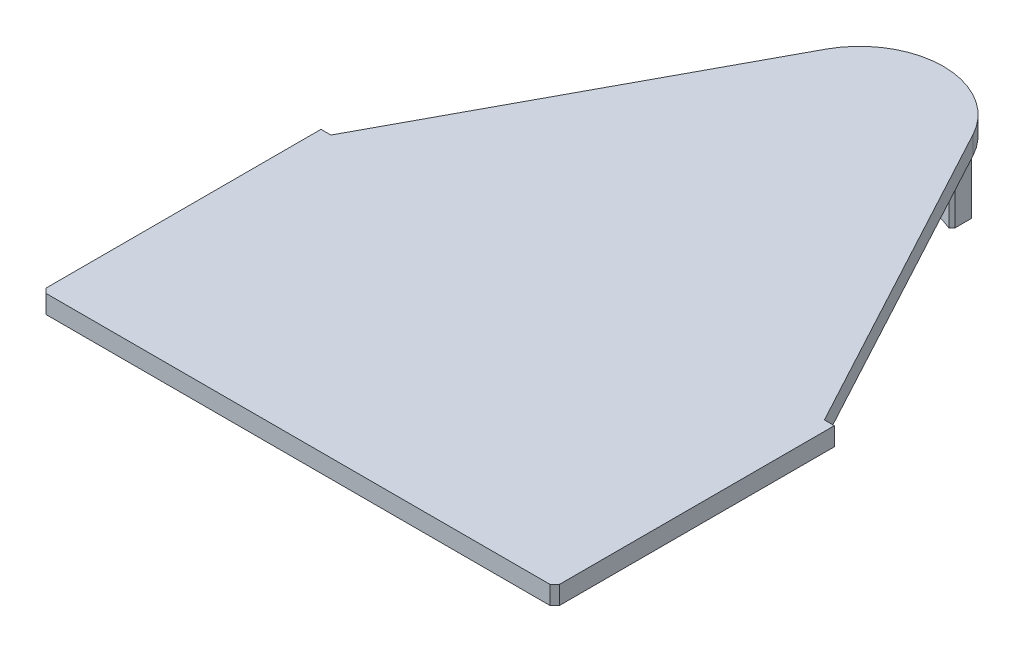
ISO-10303-21;
HEADER;
FILE_DESCRIPTION(('STEP AP214'),'2;1');
FILE_NAME('part.step','',(''),(''),'','','');
FILE_SCHEMA(('AUTOMOTIVE_DESIGN { 1 0 10303 214 1 1 1 1 }'));
ENDSEC;
DATA;
#1=APPLICATION_CONTEXT('core data for automotive mechanical design processes');
#2=APPLICATION_PROTOCOL_DEFINITION('international standard','automotive_design',2000,#1);
#3=PRODUCT_CONTEXT('',#1,'mechanical');
#4=PRODUCT('Part','Part','',(#3));
#5=PRODUCT_RELATED_PRODUCT_CATEGORY('part','',(#4));
#6=PRODUCT_DEFINITION_FORMATION('','',#4);
#7=PRODUCT_DEFINITION_CONTEXT('part definition',#1,'design');
#8=PRODUCT_DEFINITION('design','',#6,#7);
#9=PRODUCT_DEFINITION_SHAPE('','',#8);
#10=(LENGTH_UNIT() NAMED_UNIT(*) SI_UNIT(.MILLI.,.METRE.));
#11=(NAMED_UNIT(*) PLANE_ANGLE_UNIT() SI_UNIT($,.RADIAN.));
#12=(NAMED_UNIT(*) SI_UNIT($,.STERADIAN.) SOLID_ANGLE_UNIT());
#13=UNCERTAINTY_MEASURE_WITH_UNIT(LENGTH_MEASURE(1.E-05),#10,'distance_accuracy_value','');
#14=(GEOMETRIC_REPRESENTATION_CONTEXT(3) GLOBAL_UNCERTAINTY_ASSIGNED_CONTEXT((#13)) GLOBAL_UNIT_ASSIGNED_CONTEXT((#10,
#11,#12)) REPRESENTATION_CONTEXT('',''));
#15=CARTESIAN_POINT('',(0.,0.,0.));
#16=DIRECTION('',(0.,0.,1.));
#17=DIRECTION('',(1.,0.,0.));
#18=AXIS2_PLACEMENT_3D('',#15,#16,#17);
#19=CARTESIAN_POINT('',(0.,0.,0.));
#20=DIRECTION('',(0.,1.,0.));
#21=DIRECTION('',(0.,0.,1.));
#22=AXIS2_PLACEMENT_3D('',#19,#20,#21);
#23=PLANE('',#22);
#24=CARTESIAN_POINT('',(-4.,0.,-31.8382479884705));
#25=CARTESIAN_POINT('',(0.,0.,-33.6817520115295));
#26=CARTESIAN_POINT('',(4.,0.,-31.8382479884705));
#27=B_SPLINE_CURVE_WITH_KNOTS('',2,(#24,#25,#26),.UNSPECIFIED.,.F.,.F.,(3,3),(0.,1.),.UNSPECIFIED.);
#28=CARTESIAN_POINT('',(-4.,0.,-31.8382479884705));
#29=VERTEX_POINT('',#28);
#30=CARTESIAN_POINT('',(3.18321757841744E-13,0.,-32.76));
#31=VERTEX_POINT('',#30);
#32=EDGE_CURVE('E426',#29,#31,#27,.T.);
#33=ORIENTED_EDGE('',*,*,#32,.F.);
#34=CARTESIAN_POINT('',(0.,0.,-23.62));
#35=DIRECTION('',(0.,1.,0.));
#36=DIRECTION('',(0.,0.,1.));
#37=AXIS2_PLACEMENT_3D('',#34,#35,#36);
#38=CIRCLE('',#37,9.13999999999999);
#39=EDGE_CURVE('E429',#31,#29,#38,.T.);
#40=ORIENTED_EDGE('',*,*,#39,.F.);
#41=EDGE_LOOP('',(#33,#40));
#42=FACE_BOUND('',#41,.T.);
#43=ADVANCED_FACE('F90',(#42),#23,.F.);
#44=CARTESIAN_POINT('',(-4.,0.,-31.8382479884705));
#45=CARTESIAN_POINT('',(0.,0.,-33.6817520115295));
#46=CARTESIAN_POINT('',(4.,0.,-31.8382479884705));
#47=B_SPLINE_CURVE_WITH_KNOTS('',2,(#44,#45,#46),.UNSPECIFIED.,.F.,.F.,(3,3),(0.,1.),.UNSPECIFIED.);
#48=CARTESIAN_POINT('',(4.,0.,-31.8382479884705));
#49=VERTEX_POINT('',#48);
#50=EDGE_CURVE('E259',#31,#49,#47,.T.);
#51=ORIENTED_EDGE('',*,*,#50,.F.);
#52=EDGE_CURVE('E448',#49,#31,#38,.T.);
#53=ORIENTED_EDGE('',*,*,#52,.F.);
#54=EDGE_LOOP('',(#51,#53));
#55=FACE_BOUND('',#54,.T.);
#56=ADVANCED_FACE('F378',(#55),#23,.F.);
#57=CARTESIAN_POINT('',(17.9019676985238,2.,-9.62552877947724));
#58=DIRECTION('',(0.880758300386652,0.,-0.473566063290029));
#59=DIRECTION('',(-0.473566063290029,0.,-0.880758300386652));
#60=AXIS2_PLACEMENT_3D('',#57,#58,#59);
#61=PLANE('',#60);
#62=DIRECTION('',(0.473566063290029,0.,0.880758300386652));
#63=VECTOR('',#62,1.);
#64=CARTESIAN_POINT('',(17.9019676985238,0.,-9.62552877947724));
#65=LINE('',#64,#63);
#66=CARTESIAN_POINT('',(8.05013086553399,0.,-27.9483938184709));
#67=VERTEX_POINT('',#66);
#68=CARTESIAN_POINT('',(26.9164560769895,0.,7.13999999999998));
#69=VERTEX_POINT('',#68);
#70=EDGE_CURVE('E443',#67,#69,#65,.T.);
#71=ORIENTED_EDGE('',*,*,#70,.F.);
#72=DIRECTION('',(0.,-1.,0.));
#73=VECTOR('',#72,1.);
#74=CARTESIAN_POINT('',(8.05013086553399,2.,-27.9483938184709));
#75=LINE('',#74,#73);
#76=CARTESIAN_POINT('',(8.05013086553399,2.,-27.9483938184709));
#77=VERTEX_POINT('',#76);
#78=EDGE_CURVE('E508',#77,#67,#75,.T.);
#79=ORIENTED_EDGE('',*,*,#78,.F.);
#80=DIRECTION('',(0.473566063290029,0.,0.880758300386652));
#81=VECTOR('',#80,1.);
#82=CARTESIAN_POINT('',(17.9019676985238,2.,-9.62552877947724));
#83=LINE('',#82,#81);
#84=CARTESIAN_POINT('',(26.9164560769895,2.,7.13999999999998));
#85=VERTEX_POINT('',#84);
#86=EDGE_CURVE('E486',#77,#85,#83,.T.);
#87=ORIENTED_EDGE('',*,*,#86,.T.);
#88=DIRECTION('',(0.,-1.,0.));
#89=VECTOR('',#88,1.);
#90=CARTESIAN_POINT('',(26.9164560769895,2.,7.13999999999998));
#91=LINE('',#90,#89);
#92=EDGE_CURVE('E255',#85,#69,#91,.T.);
#93=ORIENTED_EDGE('',*,*,#92,.T.);
#94=EDGE_LOOP('',(#71,#79,#87,#93));
#95=FACE_BOUND('',#94,.T.);
#96=ADVANCED_FACE('F385',(#95),#61,.T.);
#97=CARTESIAN_POINT('',(0.,2.,-23.62));
#98=DIRECTION('',(0.,-1.,0.));
#99=DIRECTION('',(0.,0.,-1.));
#100=AXIS2_PLACEMENT_3D('',#97,#98,#99);
#101=CYLINDRICAL_SURFACE('',#100,9.13999999999999);
#102=EDGE_CURVE('E445',#67,#49,#38,.T.);
#103=ORIENTED_EDGE('',*,*,#102,.T.);
#104=ORIENTED_EDGE('',*,*,#52,.T.);
#105=ORIENTED_EDGE('',*,*,#39,.T.);
#106=CARTESIAN_POINT('',(-8.05013086553398,0.,-27.9483938184709));
#107=VERTEX_POINT('',#106);
#108=EDGE_CURVE('E437',#29,#107,#38,.T.);
#109=ORIENTED_EDGE('',*,*,#108,.T.);
#110=DIRECTION('',(0.,-1.,0.));
#111=VECTOR('',#110,1.);
#112=CARTESIAN_POINT('',(-8.05013086553398,2.,-27.9483938184709));
#113=LINE('',#112,#111);
#114=CARTESIAN_POINT('',(-8.05013086553398,2.,-27.9483938184709));
#115=VERTEX_POINT('',#114);
#116=EDGE_CURVE('E505',#115,#107,#113,.T.);
#117=ORIENTED_EDGE('',*,*,#116,.F.);
#118=CARTESIAN_POINT('',(0.,2.,-23.62));
#119=DIRECTION('',(0.,1.,0.));
#120=DIRECTION('',(0.,0.,1.));
#121=AXIS2_PLACEMENT_3D('',#118,#119,#120);
#122=CIRCLE('',#121,9.13999999999999);
#123=EDGE_CURVE('E490',#77,#115,#122,.T.);
#124=ORIENTED_EDGE('',*,*,#123,.F.);
#125=ORIENTED_EDGE('',*,*,#78,.T.);
#126=EDGE_LOOP('',(#103,#104,#105,#109,#117,#124,#125));
#127=FACE_BOUND('',#126,.T.);
#128=ADVANCED_FACE('F381',(#127),#101,.T.);
#129=CARTESIAN_POINT('',(-17.9019676985238,2.,-9.62552877947723));
#130=DIRECTION('',(-0.880758300386652,0.,-0.473566063290029));
#131=DIRECTION('',(-0.473566063290029,0.,0.880758300386652));
#132=AXIS2_PLACEMENT_3D('',#129,#130,#131);
#133=PLANE('',#132);
#134=DIRECTION('',(0.473566063290029,0.,-0.880758300386652));
#135=VECTOR('',#134,1.);
#136=CARTESIAN_POINT('',(-17.9019676985238,0.,-9.62552877947723));
#137=LINE('',#136,#135);
#138=CARTESIAN_POINT('',(-26.9164560769895,0.,7.14));
#139=VERTEX_POINT('',#138);
#140=EDGE_CURVE('E439',#139,#107,#137,.T.);
#141=ORIENTED_EDGE('',*,*,#140,.F.);
#142=DIRECTION('',(0.,-1.,0.));
#143=VECTOR('',#142,1.);
#144=CARTESIAN_POINT('',(-26.9164560769895,2.,7.14));
#145=LINE('',#144,#143);
#146=CARTESIAN_POINT('',(-26.9164560769895,2.,7.14));
#147=VERTEX_POINT('',#146);
#148=EDGE_CURVE('E235',#147,#139,#145,.T.);
#149=ORIENTED_EDGE('',*,*,#148,.F.);
#150=DIRECTION('',(0.473566063290029,0.,-0.880758300386652));
#151=VECTOR('',#150,1.);
#152=CARTESIAN_POINT('',(-17.9019676985238,2.,-9.62552877947723));
#153=LINE('',#152,#151);
#154=EDGE_CURVE('E493',#147,#115,#153,.T.);
#155=ORIENTED_EDGE('',*,*,#154,.T.);
#156=ORIENTED_EDGE('',*,*,#116,.T.);
#157=EDGE_LOOP('',(#141,#149,#155,#156));
#158=FACE_BOUND('',#157,.T.);
#159=ADVANCED_FACE('F376',(#158),#133,.T.);
#160=CARTESIAN_POINT('',(0.,0.,-11.81));
#161=DIRECTION('',(0.,1.,0.));
#162=DIRECTION('',(0.,0.,1.));
#163=AXIS2_PLACEMENT_3D('',#160,#161,#162);
#164=CIRCLE('',#163,3.5);
#165=CARTESIAN_POINT('',(0.,0.,-8.31));
#166=VERTEX_POINT('',#165);
#167=EDGE_CURVE('E247',#166,#166,#164,.T.);
#168=ORIENTED_EDGE('',*,*,#167,.T.);
#169=EDGE_LOOP('',(#168));
#170=FACE_BOUND('',#169,.T.);
#171=DIRECTION('',(0.,0.,-1.));
#172=VECTOR('',#171,1.);
#173=CARTESIAN_POINT('',(28.,0.,39.14));
#174=LINE('',#173,#172);
#175=CARTESIAN_POINT('',(28.,0.,37.14));
#176=VERTEX_POINT('',#175);
#177=CARTESIAN_POINT('',(28.,0.,7.13999999999999));
#178=VERTEX_POINT('',#177);
#179=EDGE_CURVE('E230',#176,#178,#174,.T.);
#180=ORIENTED_EDGE('',*,*,#179,.F.);
#181=DIRECTION('',(0.707106781186548,0.,-0.707106781186548));
#182=VECTOR('',#181,1.);
#183=CARTESIAN_POINT('',(28.,0.,37.14));
#184=LINE('',#183,#182);
#185=CARTESIAN_POINT('',(27.5,0.,37.64));
#186=VERTEX_POINT('',#185);
#187=EDGE_CURVE('E301',#176,#186,#184,.F.);
#188=ORIENTED_EDGE('',*,*,#187,.T.);
#189=DIRECTION('',(1.,0.,0.));
#190=VECTOR('',#189,1.);
#191=CARTESIAN_POINT('',(-28.,0.,37.64));
#192=LINE('',#191,#190);
#193=CARTESIAN_POINT('',(-27.5,0.,37.64));
#194=VERTEX_POINT('',#193);
#195=EDGE_CURVE('E328',#194,#186,#192,.T.);
#196=ORIENTED_EDGE('',*,*,#195,.F.);
#197=DIRECTION('',(0.707106781186548,0.,0.707106781186548));
#198=VECTOR('',#197,1.);
#199=CARTESIAN_POINT('',(-28.,0.,37.14));
#200=LINE('',#199,#198);
#201=CARTESIAN_POINT('',(-28.,0.,37.14));
#202=VERTEX_POINT('',#201);
#203=EDGE_CURVE('E228',#194,#202,#200,.F.);
#204=ORIENTED_EDGE('',*,*,#203,.T.);
#205=DIRECTION('',(0.,0.,1.));
#206=VECTOR('',#205,1.);
#207=CARTESIAN_POINT('',(-28.,0.,39.14));
#208=LINE('',#207,#206);
#209=CARTESIAN_POINT('',(-28.,0.,7.13999999999998));
#210=VERTEX_POINT('',#209);
#211=EDGE_CURVE('E211',#210,#202,#208,.T.);
#212=ORIENTED_EDGE('',*,*,#211,.F.);
#213=DIRECTION('',(1.,0.,0.));
#214=VECTOR('',#213,1.);
#215=CARTESIAN_POINT('',(-29.5,0.,7.14));
#216=LINE('',#215,#214);
#217=EDGE_CURVE('E224',#210,#139,#216,.T.);
#218=ORIENTED_EDGE('',*,*,#217,.T.);
#219=ORIENTED_EDGE('',*,*,#140,.T.);
#220=ORIENTED_EDGE('',*,*,#108,.F.);
#221=DIRECTION('',(0.,0.,1.));
#222=VECTOR('',#221,1.);
#223=CARTESIAN_POINT('',(-4.,0.,0.));
#224=LINE('',#223,#222);
#225=CARTESIAN_POINT('',(-4.,0.,-29.9151086540746));
#226=VERTEX_POINT('',#225);
#227=EDGE_CURVE('E434',#29,#226,#224,.T.);
#228=ORIENTED_EDGE('',*,*,#227,.T.);
#229=DIRECTION('',(-0.938154131916574,0.,-0.346217886262192));
#230=VECTOR('',#229,1.);
#231=CARTESIAN_POINT('',(9.23713172065873,0.,-25.0300566049639));
#232=LINE('',#231,#230);
#233=CARTESIAN_POINT('',(-3.53061183633768,0.,-29.7418849029483));
#234=VERTEX_POINT('',#233);
#235=EDGE_CURVE('E288',#226,#234,#232,.F.);
#236=ORIENTED_EDGE('',*,*,#235,.T.);
#237=CARTESIAN_POINT('',(-4.,0.,-29.5382479884705));
#238=CARTESIAN_POINT('',(0.,0.,-31.3817520115294));
#239=CARTESIAN_POINT('',(4.,0.,-29.5382479884705));
#240=B_SPLINE_CURVE_WITH_KNOTS('',2,(#237,#238,#239),.UNSPECIFIED.,.F.,.F.,(3,3),(0.,1.),.UNSPECIFIED.);
#241=CARTESIAN_POINT('',(3.65299104200132,0.,-29.691239030471));
#242=VERTEX_POINT('',#241);
#243=EDGE_CURVE('E340',#234,#242,#240,.T.);
#244=ORIENTED_EDGE('',*,*,#243,.T.);
#245=DIRECTION('',(-0.707106781186738,0.,0.707106781186358));
#246=VECTOR('',#245,1.);
#247=CARTESIAN_POINT('',(-13.0191239942364,0.,-13.0191239942433));
#248=LINE('',#247,#246);
#249=CARTESIAN_POINT('',(4.,0.,-30.0382479884706));
#250=VERTEX_POINT('',#249);
#251=EDGE_CURVE('E291',#242,#250,#248,.F.);
#252=ORIENTED_EDGE('',*,*,#251,.T.);
#253=DIRECTION('',(0.,0.,1.));
#254=VECTOR('',#253,1.);
#255=CARTESIAN_POINT('',(4.,0.,0.));
#256=LINE('',#255,#254);
#257=EDGE_CURVE('E349',#49,#250,#256,.T.);
#258=ORIENTED_EDGE('',*,*,#257,.F.);
#259=ORIENTED_EDGE('',*,*,#102,.F.);
#260=ORIENTED_EDGE('',*,*,#70,.T.);
#261=EDGE_CURVE('E239',#69,#178,#216,.T.);
#262=ORIENTED_EDGE('',*,*,#261,.T.);
#263=EDGE_LOOP('',(#180,#188,#196,#204,#212,#218,#219,#220,#228,#236,#244,#252,#258,#259,#260,#262));
#264=FACE_BOUND('',#263,.T.);
#265=ADVANCED_FACE('F222',(#170,#264),#23,.F.);
#266=CARTESIAN_POINT('',(0.,2.,0.));
#267=DIRECTION('',(0.,1.,0.));
#268=DIRECTION('',(0.,0.,1.));
#269=AXIS2_PLACEMENT_3D('',#266,#267,#268);
#270=PLANE('',#269);
#271=DIRECTION('',(-1.,0.,0.));
#272=VECTOR('',#271,1.);
#273=CARTESIAN_POINT('',(0.,2.,37.64));
#274=LINE('',#273,#272);
#275=CARTESIAN_POINT('',(27.5,2.,37.64));
#276=VERTEX_POINT('',#275);
#277=CARTESIAN_POINT('',(-27.5,2.,37.64));
#278=VERTEX_POINT('',#277);
#279=EDGE_CURVE('E231',#276,#278,#274,.T.);
#280=ORIENTED_EDGE('',*,*,#279,.F.);
#281=DIRECTION('',(-0.707106781186548,0.,0.707106781186548));
#282=VECTOR('',#281,1.);
#283=CARTESIAN_POINT('',(32.57,2.,32.57));
#284=LINE('',#283,#282);
#285=CARTESIAN_POINT('',(28.,2.,37.14));
#286=VERTEX_POINT('',#285);
#287=EDGE_CURVE('E100',#276,#286,#284,.F.);
#288=ORIENTED_EDGE('',*,*,#287,.T.);
#289=DIRECTION('',(0.,0.,1.));
#290=VECTOR('',#289,1.);
#291=CARTESIAN_POINT('',(28.,2.,0.));
#292=LINE('',#291,#290);
#293=CARTESIAN_POINT('',(28.,2.,7.13999999999998));
#294=VERTEX_POINT('',#293);
#295=EDGE_CURVE('E317',#294,#286,#292,.T.);
#296=ORIENTED_EDGE('',*,*,#295,.F.);
#297=DIRECTION('',(1.,0.,0.));
#298=VECTOR('',#297,1.);
#299=CARTESIAN_POINT('',(-29.5,2.,7.14));
#300=LINE('',#299,#298);
#301=EDGE_CURVE('E238',#85,#294,#300,.T.);
#302=ORIENTED_EDGE('',*,*,#301,.F.);
#303=ORIENTED_EDGE('',*,*,#86,.F.);
#304=ORIENTED_EDGE('',*,*,#123,.T.);
#305=ORIENTED_EDGE('',*,*,#154,.F.);
#306=CARTESIAN_POINT('',(-28.,2.,7.14));
#307=VERTEX_POINT('',#306);
#308=EDGE_CURVE('E244',#307,#147,#300,.T.);
#309=ORIENTED_EDGE('',*,*,#308,.F.);
#310=DIRECTION('',(0.,0.,-1.));
#311=VECTOR('',#310,1.);
#312=CARTESIAN_POINT('',(-28.,2.,0.));
#313=LINE('',#312,#311);
#314=CARTESIAN_POINT('',(-28.,2.,37.14));
#315=VERTEX_POINT('',#314);
#316=EDGE_CURVE('E212',#315,#307,#313,.T.);
#317=ORIENTED_EDGE('',*,*,#316,.F.);
#318=DIRECTION('',(-0.707106781186548,0.,-0.707106781186548));
#319=VECTOR('',#318,1.);
#320=CARTESIAN_POINT('',(-32.57,2.,32.57));
#321=LINE('',#320,#319);
#322=EDGE_CURVE('E107',#315,#278,#321,.F.);
#323=ORIENTED_EDGE('',*,*,#322,.T.);
#324=EDGE_LOOP('',(#280,#288,#296,#302,#303,#304,#305,#309,#317,#323));
#325=FACE_BOUND('',#324,.T.);
#326=ADVANCED_FACE('F315',(#325),#270,.T.);
#327=CARTESIAN_POINT('',(-29.5,2.,7.14));
#328=DIRECTION('',(0.,0.,-1.));
#329=DIRECTION('',(-1.,0.,0.));
#330=AXIS2_PLACEMENT_3D('',#327,#328,#329);
#331=PLANE('',#330);
#332=DIRECTION('',(0.,-1.,0.));
#333=VECTOR('',#332,1.);
#334=CARTESIAN_POINT('',(-28.,2.,7.14));
#335=LINE('',#334,#333);
#336=EDGE_CURVE('E208',#307,#210,#335,.T.);
#337=ORIENTED_EDGE('',*,*,#336,.F.);
#338=ORIENTED_EDGE('',*,*,#308,.T.);
#339=ORIENTED_EDGE('',*,*,#148,.T.);
#340=ORIENTED_EDGE('',*,*,#217,.F.);
#341=EDGE_LOOP('',(#337,#338,#339,#340));
#342=FACE_BOUND('',#341,.T.);
#343=ADVANCED_FACE('F233',(#342),#331,.T.);
#344=DIRECTION('',(0.,1.,0.));
#345=VECTOR('',#344,1.);
#346=CARTESIAN_POINT('',(28.,2.,7.13999999999999));
#347=LINE('',#346,#345);
#348=EDGE_CURVE('E218',#178,#294,#347,.T.);
#349=ORIENTED_EDGE('',*,*,#348,.F.);
#350=ORIENTED_EDGE('',*,*,#261,.F.);
#351=ORIENTED_EDGE('',*,*,#92,.F.);
#352=ORIENTED_EDGE('',*,*,#301,.T.);
#353=EDGE_LOOP('',(#349,#350,#351,#352));
#354=FACE_BOUND('',#353,.T.);
#355=ADVANCED_FACE('F370',(#354),#331,.T.);
#356=CARTESIAN_POINT('',(0.,-9.,-11.81));
#357=DIRECTION('',(0.,1.,0.));
#358=DIRECTION('',(0.,0.,1.));
#359=AXIS2_PLACEMENT_3D('',#356,#357,#358);
#360=CYLINDRICAL_SURFACE('',#359,3.5);
#361=CARTESIAN_POINT('',(0.,-8.5,-11.81));
#362=DIRECTION('',(0.,1.,0.));
#363=DIRECTION('',(0.,0.,1.));
#364=AXIS2_PLACEMENT_3D('',#361,#362,#363);
#365=CIRCLE('',#364,3.5);
#366=CARTESIAN_POINT('',(0.,-8.5,-8.31));
#367=VERTEX_POINT('',#366);
#368=EDGE_CURVE('E250',#367,#367,#365,.T.);
#369=ORIENTED_EDGE('',*,*,#368,.T.);
#370=EDGE_LOOP('',(#369));
#371=FACE_BOUND('',#370,.T.);
#372=ORIENTED_EDGE('',*,*,#167,.F.);
#373=EDGE_LOOP('',(#372));
#374=FACE_BOUND('',#373,.T.);
#375=ADVANCED_FACE('F366',(#371,#374),#360,.T.);
#376=CARTESIAN_POINT('',(0.,-9.,-11.81));
#377=DIRECTION('',(0.,1.,0.));
#378=DIRECTION('',(0.,0.,1.));
#379=AXIS2_PLACEMENT_3D('',#376,#377,#378);
#380=PLANE('',#379);
#381=CARTESIAN_POINT('',(0.,-9.,-11.81));
#382=DIRECTION('',(0.,1.,0.));
#383=DIRECTION('',(0.,0.,1.));
#384=AXIS2_PLACEMENT_3D('',#381,#382,#383);
#385=CIRCLE('',#384,3.);
#386=CARTESIAN_POINT('',(0.,-9.,-8.81));
#387=VERTEX_POINT('',#386);
#388=EDGE_CURVE('E254',#387,#387,#385,.F.);
#389=ORIENTED_EDGE('',*,*,#388,.T.);
#390=EDGE_LOOP('',(#389));
#391=FACE_BOUND('',#390,.T.);
#392=ADVANCED_FACE('F363',(#391),#380,.F.);
#393=CARTESIAN_POINT('',(0.,-8.5,-11.81));
#394=DIRECTION('',(0.,1.,0.));
#395=DIRECTION('',(0.,0.,1.));
#396=AXIS2_PLACEMENT_3D('',#393,#394,#395);
#397=TOROIDAL_SURFACE('',#396,3.,0.5);
#398=ORIENTED_EDGE('',*,*,#388,.F.);
#399=EDGE_LOOP('',(#398));
#400=FACE_BOUND('',#399,.T.);
#401=ORIENTED_EDGE('',*,*,#368,.F.);
#402=EDGE_LOOP('',(#401));
#403=FACE_BOUND('',#402,.T.);
#404=ADVANCED_FACE('F360',(#400,#403),#397,.T.);
#405=CARTESIAN_POINT('',(-4.,-9.9,-29.5382479884705));
#406=CARTESIAN_POINT('',(0.,-9.9,-31.3817520115294));
#407=CARTESIAN_POINT('',(4.,-9.9,-29.5382479884705));
#408=B_SPLINE_CURVE_WITH_KNOTS('',2,(#405,#406,#407),.UNSPECIFIED.,.F.,.F.,(3,3),(0.,1.),.UNSPECIFIED.);
#409=DIRECTION('',(0.,1.,0.));
#410=VECTOR('',#409,1.);
#411=SURFACE_OF_LINEAR_EXTRUSION('',#408,#410);
#412=ORIENTED_EDGE('',*,*,#243,.F.);
#413=DIRECTION('',(0.,1.,0.));
#414=VECTOR('',#413,1.);
#415=CARTESIAN_POINT('',(-3.53061183633005,0.,-29.7418849029514));
#416=LINE('',#415,#414);
#417=CARTESIAN_POINT('',(-3.53061183633767,-9.9,-29.7418849029483));
#418=VERTEX_POINT('',#417);
#419=EDGE_CURVE('E276',#234,#418,#416,.F.);
#420=ORIENTED_EDGE('',*,*,#419,.T.);
#421=CARTESIAN_POINT('',(3.65299104200055,-9.9,-29.6912390304713));
#422=VERTEX_POINT('',#421);
#423=EDGE_CURVE('E341',#418,#422,#408,.T.);
#424=ORIENTED_EDGE('',*,*,#423,.T.);
#425=DIRECTION('',(0.,1.,0.));
#426=VECTOR('',#425,1.);
#427=CARTESIAN_POINT('',(3.65299104200055,-9.9,-29.6912390304713));
#428=LINE('',#427,#426);
#429=EDGE_CURVE('E272',#422,#242,#428,.T.);
#430=ORIENTED_EDGE('',*,*,#429,.T.);
#431=EDGE_LOOP('',(#412,#420,#424,#430));
#432=FACE_BOUND('',#431,.T.);
#433=ADVANCED_FACE('F355',(#432),#411,.T.);
#434=CARTESIAN_POINT('',(-4.,-9.9,0.));
#435=DIRECTION('',(-1.,0.,0.));
#436=DIRECTION('',(0.,0.,1.));
#437=AXIS2_PLACEMENT_3D('',#434,#435,#436);
#438=PLANE('',#437);
#439=DIRECTION('',(0.,0.,1.));
#440=VECTOR('',#439,1.);
#441=CARTESIAN_POINT('',(-4.,-9.9,0.));
#442=LINE('',#441,#440);
#443=CARTESIAN_POINT('',(-3.99999999999999,-9.9,-31.8382479884705));
#444=VERTEX_POINT('',#443);
#445=CARTESIAN_POINT('',(-4.,-9.9,-29.9151086540746));
#446=VERTEX_POINT('',#445);
#447=EDGE_CURVE('E348',#444,#446,#442,.T.);
#448=ORIENTED_EDGE('',*,*,#447,.T.);
#449=DIRECTION('',(0.,1.,0.));
#450=VECTOR('',#449,1.);
#451=CARTESIAN_POINT('',(-4.,-9.9,-29.9151086540746));
#452=LINE('',#451,#450);
#453=EDGE_CURVE('E265',#446,#226,#452,.T.);
#454=ORIENTED_EDGE('',*,*,#453,.T.);
#455=ORIENTED_EDGE('',*,*,#227,.F.);
#456=DIRECTION('',(0.,1.,0.));
#457=VECTOR('',#456,1.);
#458=CARTESIAN_POINT('',(-3.99999999999999,-9.9,-31.8382479884705));
#459=LINE('',#458,#457);
#460=EDGE_CURVE('E451',#444,#29,#459,.T.);
#461=ORIENTED_EDGE('',*,*,#460,.F.);
#462=EDGE_LOOP('',(#448,#454,#455,#461));
#463=FACE_BOUND('',#462,.T.);
#464=ADVANCED_FACE('F359',(#463),#438,.T.);
#465=CARTESIAN_POINT('',(-4.,-9.9,-31.8382479884705));
#466=CARTESIAN_POINT('',(0.,-9.9,-33.6817520115295));
#467=CARTESIAN_POINT('',(4.,-9.9,-31.8382479884705));
#468=B_SPLINE_CURVE_WITH_KNOTS('',2,(#465,#466,#467),.UNSPECIFIED.,.F.,.F.,(3,3),(0.,1.),.UNSPECIFIED.);
#469=DIRECTION('',(0.,1.,0.));
#470=VECTOR('',#469,1.);
#471=SURFACE_OF_LINEAR_EXTRUSION('',#468,#470);
#472=ORIENTED_EDGE('',*,*,#32,.T.);
#473=ORIENTED_EDGE('',*,*,#50,.T.);
#474=DIRECTION('',(0.,1.,0.));
#475=VECTOR('',#474,1.);
#476=CARTESIAN_POINT('',(3.99999999999999,-9.9,-31.8382479884705));
#477=LINE('',#476,#475);
#478=CARTESIAN_POINT('',(3.99999999999999,-9.9,-31.8382479884705));
#479=VERTEX_POINT('',#478);
#480=EDGE_CURVE('E459',#479,#49,#477,.T.);
#481=ORIENTED_EDGE('',*,*,#480,.F.);
#482=EDGE_CURVE('E454',#444,#479,#468,.T.);
#483=ORIENTED_EDGE('',*,*,#482,.F.);
#484=ORIENTED_EDGE('',*,*,#460,.T.);
#485=EDGE_LOOP('',(#472,#473,#481,#483,#484));
#486=FACE_BOUND('',#485,.T.);
#487=ADVANCED_FACE('F452',(#486),#471,.F.);
#488=CARTESIAN_POINT('',(4.,-9.9,0.));
#489=DIRECTION('',(-1.,0.,0.));
#490=DIRECTION('',(0.,0.,1.));
#491=AXIS2_PLACEMENT_3D('',#488,#489,#490);
#492=PLANE('',#491);
#493=ORIENTED_EDGE('',*,*,#257,.T.);
#494=DIRECTION('',(0.,-1.,0.));
#495=VECTOR('',#494,1.);
#496=CARTESIAN_POINT('',(4.,-9.9,-30.0382479884706));
#497=LINE('',#496,#495);
#498=CARTESIAN_POINT('',(4.,-9.9,-30.0382479884706));
#499=VERTEX_POINT('',#498);
#500=EDGE_CURVE('E285',#250,#499,#497,.T.);
#501=ORIENTED_EDGE('',*,*,#500,.T.);
#502=DIRECTION('',(0.,0.,1.));
#503=VECTOR('',#502,1.);
#504=CARTESIAN_POINT('',(4.,-9.9,0.));
#505=LINE('',#504,#503);
#506=EDGE_CURVE('E481',#479,#499,#505,.T.);
#507=ORIENTED_EDGE('',*,*,#506,.F.);
#508=ORIENTED_EDGE('',*,*,#480,.T.);
#509=EDGE_LOOP('',(#493,#501,#507,#508));
#510=FACE_BOUND('',#509,.T.);
#511=ADVANCED_FACE('F519',(#510),#492,.F.);
#512=CARTESIAN_POINT('',(0.,-9.9,0.));
#513=DIRECTION('',(0.,-1.,0.));
#514=DIRECTION('',(0.,0.,-1.));
#515=AXIS2_PLACEMENT_3D('',#512,#513,#514);
#516=PLANE('',#515);
#517=ORIENTED_EDGE('',*,*,#423,.F.);
#518=DIRECTION('',(0.938154131916574,0.,0.346217886262192));
#519=VECTOR('',#518,1.);
#520=CARTESIAN_POINT('',(9.23713172065873,-9.9,-25.0300566049639));
#521=LINE('',#520,#519);
#522=EDGE_CURVE('E282',#418,#446,#521,.F.);
#523=ORIENTED_EDGE('',*,*,#522,.T.);
#524=ORIENTED_EDGE('',*,*,#447,.F.);
#525=ORIENTED_EDGE('',*,*,#482,.T.);
#526=ORIENTED_EDGE('',*,*,#506,.T.);
#527=DIRECTION('',(0.707106781186738,0.,-0.707106781186358));
#528=VECTOR('',#527,1.);
#529=CARTESIAN_POINT('',(-13.0191239942364,-9.9,-13.0191239942433));
#530=LINE('',#529,#528);
#531=EDGE_CURVE('E279',#499,#422,#530,.F.);
#532=ORIENTED_EDGE('',*,*,#531,.T.);
#533=EDGE_LOOP('',(#517,#523,#524,#525,#526,#532));
#534=FACE_BOUND('',#533,.T.);
#535=ADVANCED_FACE('F403',(#534),#516,.T.);
#536=CARTESIAN_POINT('',(-4.,-4.95,-29.9151086540746));
#537=DIRECTION('',(0.346217886262192,0.,-0.938154131916574));
#538=DIRECTION('',(0.,1.,0.));
#539=AXIS2_PLACEMENT_3D('',#536,#537,#538);
#540=PLANE('',#539);
#541=ORIENTED_EDGE('',*,*,#522,.F.);
#542=ORIENTED_EDGE('',*,*,#419,.F.);
#543=ORIENTED_EDGE('',*,*,#235,.F.);
#544=ORIENTED_EDGE('',*,*,#453,.F.);
#545=EDGE_LOOP('',(#541,#542,#543,#544));
#546=FACE_BOUND('',#545,.T.);
#547=ADVANCED_FACE('F396',(#546),#540,.F.);
#548=CARTESIAN_POINT('',(3.65299104200055,-4.95,-29.6912390304713));
#549=DIRECTION('',(-0.707106781186357,0.,-0.707106781186737));
#550=DIRECTION('',(0.,1.,0.));
#551=AXIS2_PLACEMENT_3D('',#548,#549,#550);
#552=PLANE('',#551);
#553=ORIENTED_EDGE('',*,*,#531,.F.);
#554=ORIENTED_EDGE('',*,*,#500,.F.);
#555=ORIENTED_EDGE('',*,*,#251,.F.);
#556=ORIENTED_EDGE('',*,*,#429,.F.);
#557=EDGE_LOOP('',(#553,#554,#555,#556));
#558=FACE_BOUND('',#557,.T.);
#559=ADVANCED_FACE('F402',(#558),#552,.F.);
#560=CARTESIAN_POINT('',(28.,10.,39.14));
#561=DIRECTION('',(-1.,0.,0.));
#562=DIRECTION('',(0.,0.,1.));
#563=AXIS2_PLACEMENT_3D('',#560,#561,#562);
#564=PLANE('',#563);
#565=ORIENTED_EDGE('',*,*,#295,.T.);
#566=DIRECTION('',(0.,-1.,0.));
#567=VECTOR('',#566,1.);
#568=CARTESIAN_POINT('',(28.,10.,37.14));
#569=LINE('',#568,#567);
#570=EDGE_CURVE('E217',#286,#176,#569,.T.);
#571=ORIENTED_EDGE('',*,*,#570,.T.);
#572=ORIENTED_EDGE('',*,*,#179,.T.);
#573=ORIENTED_EDGE('',*,*,#348,.T.);
#574=EDGE_LOOP('',(#565,#571,#572,#573));
#575=FACE_BOUND('',#574,.T.);
#576=ADVANCED_FACE('F322',(#575),#564,.F.);
#577=CARTESIAN_POINT('',(-28.,10.,39.14));
#578=DIRECTION('',(1.,0.,0.));
#579=DIRECTION('',(0.,0.,-1.));
#580=AXIS2_PLACEMENT_3D('',#577,#578,#579);
#581=PLANE('',#580);
#582=ORIENTED_EDGE('',*,*,#211,.T.);
#583=DIRECTION('',(0.,1.,0.));
#584=VECTOR('',#583,1.);
#585=CARTESIAN_POINT('',(-28.,10.,37.14));
#586=LINE('',#585,#584);
#587=EDGE_CURVE('E12',#202,#315,#586,.T.);
#588=ORIENTED_EDGE('',*,*,#587,.T.);
#589=ORIENTED_EDGE('',*,*,#316,.T.);
#590=ORIENTED_EDGE('',*,*,#336,.T.);
#591=EDGE_LOOP('',(#582,#588,#589,#590));
#592=FACE_BOUND('',#591,.T.);
#593=ADVANCED_FACE('F210',(#592),#581,.F.);
#594=CARTESIAN_POINT('',(-28.,10.,37.64));
#595=DIRECTION('',(0.,0.,-1.));
#596=DIRECTION('',(-1.,0.,0.));
#597=AXIS2_PLACEMENT_3D('',#594,#595,#596);
#598=PLANE('',#597);
#599=ORIENTED_EDGE('',*,*,#195,.T.);
#600=DIRECTION('',(0.,1.,0.));
#601=VECTOR('',#600,1.);
#602=CARTESIAN_POINT('',(27.5,10.,37.64));
#603=LINE('',#602,#601);
#604=EDGE_CURVE('E307',#186,#276,#603,.T.);
#605=ORIENTED_EDGE('',*,*,#604,.T.);
#606=ORIENTED_EDGE('',*,*,#279,.T.);
#607=DIRECTION('',(0.,-1.,0.));
#608=VECTOR('',#607,1.);
#609=CARTESIAN_POINT('',(-27.5,10.,37.64));
#610=LINE('',#609,#608);
#611=EDGE_CURVE('E304',#278,#194,#610,.T.);
#612=ORIENTED_EDGE('',*,*,#611,.T.);
#613=EDGE_LOOP('',(#599,#605,#606,#612));
#614=FACE_BOUND('',#613,.T.);
#615=ADVANCED_FACE('F330',(#614),#598,.F.);
#616=CARTESIAN_POINT('',(28.,10.,37.14));
#617=DIRECTION('',(-0.707106781186547,0.,-0.707106781186547));
#618=DIRECTION('',(0.,-1.,0.));
#619=AXIS2_PLACEMENT_3D('',#616,#617,#618);
#620=PLANE('',#619);
#621=ORIENTED_EDGE('',*,*,#287,.F.);
#622=ORIENTED_EDGE('',*,*,#604,.F.);
#623=ORIENTED_EDGE('',*,*,#187,.F.);
#624=ORIENTED_EDGE('',*,*,#570,.F.);
#625=EDGE_LOOP('',(#621,#622,#623,#624));
#626=FACE_BOUND('',#625,.T.);
#627=ADVANCED_FACE('F326',(#626),#620,.F.);
#628=CARTESIAN_POINT('',(-28.,10.,37.14));
#629=DIRECTION('',(0.707106781186547,0.,-0.707106781186547));
#630=DIRECTION('',(0.,1.,0.));
#631=AXIS2_PLACEMENT_3D('',#628,#629,#630);
#632=PLANE('',#631);
#633=ORIENTED_EDGE('',*,*,#203,.F.);
#634=ORIENTED_EDGE('',*,*,#611,.F.);
#635=ORIENTED_EDGE('',*,*,#322,.F.);
#636=ORIENTED_EDGE('',*,*,#587,.F.);
#637=EDGE_LOOP('',(#633,#634,#635,#636));
#638=FACE_BOUND('',#637,.T.);
#639=ADVANCED_FACE('F93',(#638),#632,.F.);
#640=CLOSED_SHELL('',(#43,#56,#96,#128,#159,#265,#326,#343,#355,#375,#392,#404,#433,#464,#487,
#511,#535,#547,#559,#576,#593,#615,#627,#639));
#641=MANIFOLD_SOLID_BREP('B2',#640);
#642=ADVANCED_BREP_SHAPE_REPRESENTATION('',(#18,#641),#14);
#643=SHAPE_DEFINITION_REPRESENTATION(#9,#642);
ENDSEC;
END-ISO-10303-21;
